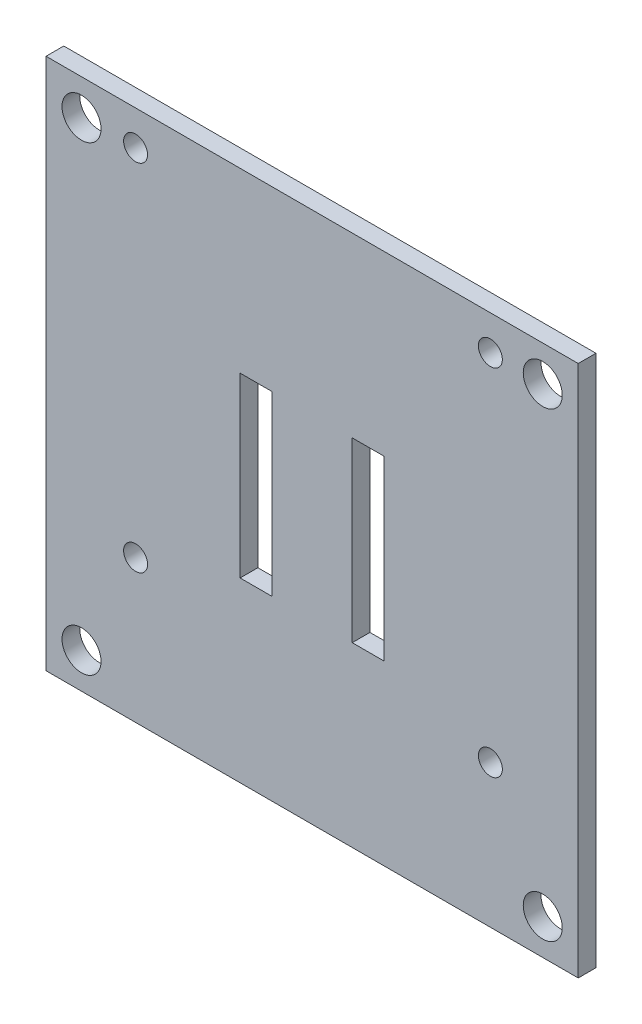
ISO-10303-21;
HEADER;
FILE_DESCRIPTION(('STEP AP214'),'2;1');
FILE_NAME('part.step','',(''),(''),'','','');
FILE_SCHEMA(('AUTOMOTIVE_DESIGN { 1 0 10303 214 1 1 1 1 }'));
ENDSEC;
DATA;
#1=APPLICATION_CONTEXT('core data for automotive mechanical design processes');
#2=APPLICATION_PROTOCOL_DEFINITION('international standard','automotive_design',2000,#1);
#3=PRODUCT_CONTEXT('',#1,'mechanical');
#4=PRODUCT('Part','Part','',(#3));
#5=PRODUCT_RELATED_PRODUCT_CATEGORY('part','',(#4));
#6=PRODUCT_DEFINITION_FORMATION('','',#4);
#7=PRODUCT_DEFINITION_CONTEXT('part definition',#1,'design');
#8=PRODUCT_DEFINITION('design','',#6,#7);
#9=PRODUCT_DEFINITION_SHAPE('','',#8);
#10=(LENGTH_UNIT() NAMED_UNIT(*) SI_UNIT(.MILLI.,.METRE.));
#11=(NAMED_UNIT(*) PLANE_ANGLE_UNIT() SI_UNIT($,.RADIAN.));
#12=(NAMED_UNIT(*) SI_UNIT($,.STERADIAN.) SOLID_ANGLE_UNIT());
#13=UNCERTAINTY_MEASURE_WITH_UNIT(LENGTH_MEASURE(1.E-05),#10,'distance_accuracy_value','');
#14=(GEOMETRIC_REPRESENTATION_CONTEXT(3) GLOBAL_UNCERTAINTY_ASSIGNED_CONTEXT((#13)) GLOBAL_UNIT_ASSIGNED_CONTEXT((#10,
#11,#12)) REPRESENTATION_CONTEXT('',''));
#15=CARTESIAN_POINT('',(0.,0.,0.));
#16=DIRECTION('',(0.,0.,1.));
#17=DIRECTION('',(1.,0.,0.));
#18=AXIS2_PLACEMENT_3D('',#15,#16,#17);
#19=CARTESIAN_POINT('',(38.1,-38.1,2.54));
#20=DIRECTION('',(-1.,0.,0.));
#21=DIRECTION('',(0.,0.,1.));
#22=AXIS2_PLACEMENT_3D('',#19,#20,#21);
#23=PLANE('',#22);
#24=DIRECTION('',(0.,1.,0.));
#25=VECTOR('',#24,1.);
#26=CARTESIAN_POINT('',(38.1,-38.1,0.));
#27=LINE('',#26,#25);
#28=CARTESIAN_POINT('',(38.1,-38.1,0.));
#29=VERTEX_POINT('',#28);
#30=CARTESIAN_POINT('',(38.1,38.1,0.));
#31=VERTEX_POINT('',#30);
#32=EDGE_CURVE('E191',#29,#31,#27,.T.);
#33=ORIENTED_EDGE('',*,*,#32,.T.);
#34=DIRECTION('',(0.,0.,-1.));
#35=VECTOR('',#34,1.);
#36=CARTESIAN_POINT('',(38.1,38.1,2.54));
#37=LINE('',#36,#35);
#38=CARTESIAN_POINT('',(38.1,38.1,2.54));
#39=VERTEX_POINT('',#38);
#40=EDGE_CURVE('E218',#39,#31,#37,.T.);
#41=ORIENTED_EDGE('',*,*,#40,.F.);
#42=DIRECTION('',(0.,1.,0.));
#43=VECTOR('',#42,1.);
#44=CARTESIAN_POINT('',(38.1,-38.1,2.54));
#45=LINE('',#44,#43);
#46=CARTESIAN_POINT('',(38.1,-38.1,2.54));
#47=VERTEX_POINT('',#46);
#48=EDGE_CURVE('E192',#47,#39,#45,.T.);
#49=ORIENTED_EDGE('',*,*,#48,.F.);
#50=DIRECTION('',(0.,0.,-1.));
#51=VECTOR('',#50,1.);
#52=CARTESIAN_POINT('',(38.1,-38.1,2.54));
#53=LINE('',#52,#51);
#54=EDGE_CURVE('E202',#47,#29,#53,.T.);
#55=ORIENTED_EDGE('',*,*,#54,.T.);
#56=EDGE_LOOP('',(#33,#41,#49,#55));
#57=FACE_BOUND('',#56,.T.);
#58=ADVANCED_FACE('F32',(#57),#23,.F.);
#59=CARTESIAN_POINT('',(-38.1,38.1,2.54));
#60=DIRECTION('',(0.,-1.,0.));
#61=DIRECTION('',(0.,0.,-1.));
#62=AXIS2_PLACEMENT_3D('',#59,#60,#61);
#63=PLANE('',#62);
#64=DIRECTION('',(-1.,0.,0.));
#65=VECTOR('',#64,1.);
#66=CARTESIAN_POINT('',(-38.1,38.1,0.));
#67=LINE('',#66,#65);
#68=CARTESIAN_POINT('',(-38.1,38.1,0.));
#69=VERTEX_POINT('',#68);
#70=EDGE_CURVE('E205',#31,#69,#67,.T.);
#71=ORIENTED_EDGE('',*,*,#70,.T.);
#72=DIRECTION('',(0.,0.,-1.));
#73=VECTOR('',#72,1.);
#74=CARTESIAN_POINT('',(-38.1,38.1,2.54));
#75=LINE('',#74,#73);
#76=CARTESIAN_POINT('',(-38.1,38.1,2.54));
#77=VERTEX_POINT('',#76);
#78=EDGE_CURVE('E215',#77,#69,#75,.T.);
#79=ORIENTED_EDGE('',*,*,#78,.F.);
#80=DIRECTION('',(-1.,0.,0.));
#81=VECTOR('',#80,1.);
#82=CARTESIAN_POINT('',(-38.1,38.1,2.54));
#83=LINE('',#82,#81);
#84=EDGE_CURVE('E195',#39,#77,#83,.T.);
#85=ORIENTED_EDGE('',*,*,#84,.F.);
#86=ORIENTED_EDGE('',*,*,#40,.T.);
#87=EDGE_LOOP('',(#71,#79,#85,#86));
#88=FACE_BOUND('',#87,.T.);
#89=ADVANCED_FACE('F300',(#88),#63,.F.);
#90=CARTESIAN_POINT('',(-38.1,-38.1,2.54));
#91=DIRECTION('',(1.,0.,0.));
#92=DIRECTION('',(0.,0.,-1.));
#93=AXIS2_PLACEMENT_3D('',#90,#91,#92);
#94=PLANE('',#93);
#95=DIRECTION('',(0.,-1.,0.));
#96=VECTOR('',#95,1.);
#97=CARTESIAN_POINT('',(-38.1,-38.1,0.));
#98=LINE('',#97,#96);
#99=CARTESIAN_POINT('',(-38.1,-38.1,0.));
#100=VERTEX_POINT('',#99);
#101=EDGE_CURVE('E207',#69,#100,#98,.T.);
#102=ORIENTED_EDGE('',*,*,#101,.T.);
#103=DIRECTION('',(0.,0.,-1.));
#104=VECTOR('',#103,1.);
#105=CARTESIAN_POINT('',(-38.1,-38.1,2.54));
#106=LINE('',#105,#104);
#107=CARTESIAN_POINT('',(-38.1,-38.1,2.54));
#108=VERTEX_POINT('',#107);
#109=EDGE_CURVE('E212',#108,#100,#106,.T.);
#110=ORIENTED_EDGE('',*,*,#109,.F.);
#111=DIRECTION('',(0.,-1.,0.));
#112=VECTOR('',#111,1.);
#113=CARTESIAN_POINT('',(-38.1,-38.1,2.54));
#114=LINE('',#113,#112);
#115=EDGE_CURVE('E198',#77,#108,#114,.T.);
#116=ORIENTED_EDGE('',*,*,#115,.F.);
#117=ORIENTED_EDGE('',*,*,#78,.T.);
#118=EDGE_LOOP('',(#102,#110,#116,#117));
#119=FACE_BOUND('',#118,.T.);
#120=ADVANCED_FACE('F294',(#119),#94,.F.);
#121=CARTESIAN_POINT('',(-38.1,-38.1,2.54));
#122=DIRECTION('',(0.,1.,0.));
#123=DIRECTION('',(0.,0.,1.));
#124=AXIS2_PLACEMENT_3D('',#121,#122,#123);
#125=PLANE('',#124);
#126=DIRECTION('',(1.,0.,0.));
#127=VECTOR('',#126,1.);
#128=CARTESIAN_POINT('',(-38.1,-38.1,0.));
#129=LINE('',#128,#127);
#130=EDGE_CURVE('E196',#100,#29,#129,.T.);
#131=ORIENTED_EDGE('',*,*,#130,.T.);
#132=ORIENTED_EDGE('',*,*,#54,.F.);
#133=DIRECTION('',(1.,0.,0.));
#134=VECTOR('',#133,1.);
#135=CARTESIAN_POINT('',(-38.1,-38.1,2.54));
#136=LINE('',#135,#134);
#137=EDGE_CURVE('E200',#108,#47,#136,.T.);
#138=ORIENTED_EDGE('',*,*,#137,.F.);
#139=ORIENTED_EDGE('',*,*,#109,.T.);
#140=EDGE_LOOP('',(#131,#132,#138,#139));
#141=FACE_BOUND('',#140,.T.);
#142=ADVANCED_FACE('F288',(#141),#125,.F.);
#143=CARTESIAN_POINT('',(0.,0.,2.54));
#144=DIRECTION('',(0.,0.,-1.));
#145=DIRECTION('',(-1.,0.,0.));
#146=AXIS2_PLACEMENT_3D('',#143,#144,#145);
#147=PLANE('',#146);
#148=CARTESIAN_POINT('',(-33.02,-33.02,2.54));
#149=DIRECTION('',(0.,0.,-1.));
#150=DIRECTION('',(-1.,0.,0.));
#151=AXIS2_PLACEMENT_3D('',#148,#149,#150);
#152=CIRCLE('',#151,2.794);
#153=CARTESIAN_POINT('',(-35.814,-33.02,2.54));
#154=VERTEX_POINT('',#153);
#155=EDGE_CURVE('E248',#154,#154,#152,.T.);
#156=ORIENTED_EDGE('',*,*,#155,.T.);
#157=EDGE_LOOP('',(#156));
#158=FACE_BOUND('',#157,.T.);
#159=CARTESIAN_POINT('',(33.02,-33.02,2.54));
#160=DIRECTION('',(0.,0.,-1.));
#161=DIRECTION('',(-1.,0.,0.));
#162=AXIS2_PLACEMENT_3D('',#159,#160,#161);
#163=CIRCLE('',#162,2.794);
#164=CARTESIAN_POINT('',(30.226,-33.02,2.54));
#165=VERTEX_POINT('',#164);
#166=EDGE_CURVE('E251',#165,#165,#163,.T.);
#167=ORIENTED_EDGE('',*,*,#166,.T.);
#168=EDGE_LOOP('',(#167));
#169=FACE_BOUND('',#168,.T.);
#170=CARTESIAN_POINT('',(33.02,33.02,2.54));
#171=DIRECTION('',(0.,0.,-1.));
#172=DIRECTION('',(-1.,0.,0.));
#173=AXIS2_PLACEMENT_3D('',#170,#171,#172);
#174=CIRCLE('',#173,2.794);
#175=CARTESIAN_POINT('',(30.226,33.02,2.54));
#176=VERTEX_POINT('',#175);
#177=EDGE_CURVE('E254',#176,#176,#174,.T.);
#178=ORIENTED_EDGE('',*,*,#177,.T.);
#179=EDGE_LOOP('',(#178));
#180=FACE_BOUND('',#179,.T.);
#181=CARTESIAN_POINT('',(-33.02,33.02,2.54));
#182=DIRECTION('',(0.,0.,-1.));
#183=DIRECTION('',(-1.,0.,0.));
#184=AXIS2_PLACEMENT_3D('',#181,#182,#183);
#185=CIRCLE('',#184,2.794);
#186=CARTESIAN_POINT('',(-35.814,33.02,2.54));
#187=VERTEX_POINT('',#186);
#188=EDGE_CURVE('E241',#187,#187,#185,.T.);
#189=ORIENTED_EDGE('',*,*,#188,.T.);
#190=EDGE_LOOP('',(#189));
#191=FACE_BOUND('',#190,.T.);
#192=DIRECTION('',(1.,0.,0.));
#193=VECTOR('',#192,1.);
#194=CARTESIAN_POINT('',(-10.3096654054034,-12.7,2.54));
#195=LINE('',#194,#193);
#196=CARTESIAN_POINT('',(-10.3096654054034,-12.7,2.54));
#197=VERTEX_POINT('',#196);
#198=CARTESIAN_POINT('',(-5.73766540540336,-12.7,2.54));
#199=VERTEX_POINT('',#198);
#200=EDGE_CURVE('E131',#197,#199,#195,.T.);
#201=ORIENTED_EDGE('',*,*,#200,.F.);
#202=DIRECTION('',(0.,-1.,0.));
#203=VECTOR('',#202,1.);
#204=CARTESIAN_POINT('',(-10.3096654054033,12.7,2.54));
#205=LINE('',#204,#203);
#206=CARTESIAN_POINT('',(-10.3096654054033,12.7,2.54));
#207=VERTEX_POINT('',#206);
#208=EDGE_CURVE('E46',#207,#197,#205,.T.);
#209=ORIENTED_EDGE('',*,*,#208,.F.);
#210=DIRECTION('',(-1.,0.,0.));
#211=VECTOR('',#210,1.);
#212=CARTESIAN_POINT('',(-10.3096654054033,12.7,2.54));
#213=LINE('',#212,#211);
#214=CARTESIAN_POINT('',(-5.73766540540333,12.7,2.54));
#215=VERTEX_POINT('',#214);
#216=EDGE_CURVE('E138',#215,#207,#213,.T.);
#217=ORIENTED_EDGE('',*,*,#216,.F.);
#218=DIRECTION('',(0.,1.,0.));
#219=VECTOR('',#218,1.);
#220=CARTESIAN_POINT('',(-5.73766540540333,12.7,2.54));
#221=LINE('',#220,#219);
#222=EDGE_CURVE('E122',#199,#215,#221,.T.);
#223=ORIENTED_EDGE('',*,*,#222,.F.);
#224=EDGE_LOOP('',(#201,#209,#217,#223));
#225=FACE_BOUND('',#224,.T.);
#226=DIRECTION('',(1.,0.,0.));
#227=VECTOR('',#226,1.);
#228=CARTESIAN_POINT('',(10.3096654054033,-12.7,2.54));
#229=LINE('',#228,#227);
#230=CARTESIAN_POINT('',(5.73766540540335,-12.7,2.54));
#231=VERTEX_POINT('',#230);
#232=CARTESIAN_POINT('',(10.3096654054033,-12.7,2.54));
#233=VERTEX_POINT('',#232);
#234=EDGE_CURVE('E149',#231,#233,#229,.T.);
#235=ORIENTED_EDGE('',*,*,#234,.F.);
#236=DIRECTION('',(0.,-1.,0.));
#237=VECTOR('',#236,1.);
#238=CARTESIAN_POINT('',(5.73766540540334,12.7,2.54));
#239=LINE('',#238,#237);
#240=CARTESIAN_POINT('',(5.73766540540334,12.7,2.54));
#241=VERTEX_POINT('',#240);
#242=EDGE_CURVE('E145',#241,#231,#239,.T.);
#243=ORIENTED_EDGE('',*,*,#242,.F.);
#244=DIRECTION('',(-1.,0.,0.));
#245=VECTOR('',#244,1.);
#246=CARTESIAN_POINT('',(10.3096654054033,12.7,2.54));
#247=LINE('',#246,#245);
#248=CARTESIAN_POINT('',(10.3096654054033,12.7,2.54));
#249=VERTEX_POINT('',#248);
#250=EDGE_CURVE('E155',#249,#241,#247,.T.);
#251=ORIENTED_EDGE('',*,*,#250,.F.);
#252=DIRECTION('',(0.,1.,0.));
#253=VECTOR('',#252,1.);
#254=CARTESIAN_POINT('',(10.3096654054033,12.7,2.54));
#255=LINE('',#254,#253);
#256=EDGE_CURVE('E152',#233,#249,#255,.T.);
#257=ORIENTED_EDGE('',*,*,#256,.F.);
#258=EDGE_LOOP('',(#235,#243,#251,#257));
#259=FACE_BOUND('',#258,.T.);
#260=CARTESIAN_POINT('',(-25.2783226277738,33.1486818865829,2.54));
#261=DIRECTION('',(0.,0.,-1.));
#262=DIRECTION('',(-1.,0.,0.));
#263=AXIS2_PLACEMENT_3D('',#260,#261,#262);
#264=CIRCLE('',#263,1.7145);
#265=CARTESIAN_POINT('',(-26.9928226277739,33.1486818865829,2.54));
#266=VERTEX_POINT('',#265);
#267=EDGE_CURVE('E182',#266,#266,#264,.T.);
#268=ORIENTED_EDGE('',*,*,#267,.T.);
#269=EDGE_LOOP('',(#268));
#270=FACE_BOUND('',#269,.T.);
#271=CARTESIAN_POINT('',(25.5216773722261,33.1486818865829,2.54));
#272=DIRECTION('',(0.,0.,-1.));
#273=DIRECTION('',(-1.,0.,0.));
#274=AXIS2_PLACEMENT_3D('',#271,#272,#273);
#275=CIRCLE('',#274,1.7145);
#276=CARTESIAN_POINT('',(23.8071773722261,33.1486818865829,2.54));
#277=VERTEX_POINT('',#276);
#278=EDGE_CURVE('E179',#277,#277,#275,.T.);
#279=ORIENTED_EDGE('',*,*,#278,.T.);
#280=EDGE_LOOP('',(#279));
#281=FACE_BOUND('',#280,.T.);
#282=CARTESIAN_POINT('',(25.5216773722261,-17.6513181134171,2.54));
#283=DIRECTION('',(0.,0.,-1.));
#284=DIRECTION('',(-1.,0.,0.));
#285=AXIS2_PLACEMENT_3D('',#282,#283,#284);
#286=CIRCLE('',#285,1.7145);
#287=CARTESIAN_POINT('',(23.8071773722261,-17.6513181134171,2.54));
#288=VERTEX_POINT('',#287);
#289=EDGE_CURVE('E171',#288,#288,#286,.T.);
#290=ORIENTED_EDGE('',*,*,#289,.T.);
#291=EDGE_LOOP('',(#290));
#292=FACE_BOUND('',#291,.T.);
#293=CARTESIAN_POINT('',(-25.2783226277739,-17.6513181134171,2.54));
#294=DIRECTION('',(0.,0.,-1.));
#295=DIRECTION('',(-1.,0.,0.));
#296=AXIS2_PLACEMENT_3D('',#293,#294,#295);
#297=CIRCLE('',#296,1.7145);
#298=CARTESIAN_POINT('',(-26.9928226277739,-17.6513181134171,2.54));
#299=VERTEX_POINT('',#298);
#300=EDGE_CURVE('E188',#299,#299,#297,.T.);
#301=ORIENTED_EDGE('',*,*,#300,.T.);
#302=EDGE_LOOP('',(#301));
#303=FACE_BOUND('',#302,.T.);
#304=ORIENTED_EDGE('',*,*,#48,.T.);
#305=ORIENTED_EDGE('',*,*,#84,.T.);
#306=ORIENTED_EDGE('',*,*,#115,.T.);
#307=ORIENTED_EDGE('',*,*,#137,.T.);
#308=EDGE_LOOP('',(#304,#305,#306,#307));
#309=FACE_BOUND('',#308,.T.);
#310=ADVANCED_FACE('F135',(#158,#169,#180,#191,#225,#259,#270,#281,#292,#303,#309),#147,.F.);
#311=CARTESIAN_POINT('',(0.,0.,0.));
#312=DIRECTION('',(0.,0.,-1.));
#313=DIRECTION('',(-1.,0.,0.));
#314=AXIS2_PLACEMENT_3D('',#311,#312,#313);
#315=PLANE('',#314);
#316=CARTESIAN_POINT('',(-33.02,-33.02,0.));
#317=DIRECTION('',(0.,0.,-1.));
#318=DIRECTION('',(-1.,0.,0.));
#319=AXIS2_PLACEMENT_3D('',#316,#317,#318);
#320=CIRCLE('',#319,2.794);
#321=CARTESIAN_POINT('',(-35.814,-33.02,0.));
#322=VERTEX_POINT('',#321);
#323=EDGE_CURVE('E257',#322,#322,#320,.T.);
#324=ORIENTED_EDGE('',*,*,#323,.F.);
#325=EDGE_LOOP('',(#324));
#326=FACE_BOUND('',#325,.T.);
#327=CARTESIAN_POINT('',(33.02,-33.02,0.));
#328=DIRECTION('',(0.,0.,-1.));
#329=DIRECTION('',(-1.,0.,0.));
#330=AXIS2_PLACEMENT_3D('',#327,#328,#329);
#331=CIRCLE('',#330,2.794);
#332=CARTESIAN_POINT('',(30.226,-33.02,0.));
#333=VERTEX_POINT('',#332);
#334=EDGE_CURVE('E261',#333,#333,#331,.T.);
#335=ORIENTED_EDGE('',*,*,#334,.F.);
#336=EDGE_LOOP('',(#335));
#337=FACE_BOUND('',#336,.T.);
#338=CARTESIAN_POINT('',(33.02,33.02,0.));
#339=DIRECTION('',(0.,0.,-1.));
#340=DIRECTION('',(-1.,0.,0.));
#341=AXIS2_PLACEMENT_3D('',#338,#339,#340);
#342=CIRCLE('',#341,2.794);
#343=CARTESIAN_POINT('',(30.226,33.02,0.));
#344=VERTEX_POINT('',#343);
#345=EDGE_CURVE('E258',#344,#344,#342,.T.);
#346=ORIENTED_EDGE('',*,*,#345,.F.);
#347=EDGE_LOOP('',(#346));
#348=FACE_BOUND('',#347,.T.);
#349=CARTESIAN_POINT('',(-33.02,33.02,0.));
#350=DIRECTION('',(0.,0.,-1.));
#351=DIRECTION('',(-1.,0.,0.));
#352=AXIS2_PLACEMENT_3D('',#349,#350,#351);
#353=CIRCLE('',#352,2.794);
#354=CARTESIAN_POINT('',(-35.814,33.02,0.));
#355=VERTEX_POINT('',#354);
#356=EDGE_CURVE('E243',#355,#355,#353,.T.);
#357=ORIENTED_EDGE('',*,*,#356,.F.);
#358=EDGE_LOOP('',(#357));
#359=FACE_BOUND('',#358,.T.);
#360=DIRECTION('',(0.,1.,0.));
#361=VECTOR('',#360,1.);
#362=CARTESIAN_POINT('',(-10.3096654054033,0.,0.));
#363=LINE('',#362,#361);
#364=CARTESIAN_POINT('',(-10.3096654054034,-12.7,0.));
#365=VERTEX_POINT('',#364);
#366=CARTESIAN_POINT('',(-10.3096654054033,12.7,0.));
#367=VERTEX_POINT('',#366);
#368=EDGE_CURVE('E11',#365,#367,#363,.T.);
#369=ORIENTED_EDGE('',*,*,#368,.F.);
#370=DIRECTION('',(-1.,0.,0.));
#371=VECTOR('',#370,1.);
#372=CARTESIAN_POINT('',(0.,-12.7,0.));
#373=LINE('',#372,#371);
#374=CARTESIAN_POINT('',(-5.73766540540336,-12.7,0.));
#375=VERTEX_POINT('',#374);
#376=EDGE_CURVE('E230',#375,#365,#373,.T.);
#377=ORIENTED_EDGE('',*,*,#376,.F.);
#378=DIRECTION('',(0.,-1.,0.));
#379=VECTOR('',#378,1.);
#380=CARTESIAN_POINT('',(-5.73766540540334,0.,0.));
#381=LINE('',#380,#379);
#382=CARTESIAN_POINT('',(-5.73766540540333,12.7,0.));
#383=VERTEX_POINT('',#382);
#384=EDGE_CURVE('E125',#383,#375,#381,.T.);
#385=ORIENTED_EDGE('',*,*,#384,.F.);
#386=DIRECTION('',(1.,0.,0.));
#387=VECTOR('',#386,1.);
#388=CARTESIAN_POINT('',(0.,12.7,0.));
#389=LINE('',#388,#387);
#390=EDGE_CURVE('E39',#367,#383,#389,.T.);
#391=ORIENTED_EDGE('',*,*,#390,.F.);
#392=EDGE_LOOP('',(#369,#377,#385,#391));
#393=FACE_BOUND('',#392,.T.);
#394=DIRECTION('',(0.,1.,0.));
#395=VECTOR('',#394,1.);
#396=CARTESIAN_POINT('',(5.73766540540334,0.,0.));
#397=LINE('',#396,#395);
#398=CARTESIAN_POINT('',(5.73766540540335,-12.7,0.));
#399=VERTEX_POINT('',#398);
#400=CARTESIAN_POINT('',(5.73766540540334,12.7,0.));
#401=VERTEX_POINT('',#400);
#402=EDGE_CURVE('E228',#399,#401,#397,.T.);
#403=ORIENTED_EDGE('',*,*,#402,.F.);
#404=DIRECTION('',(-1.,0.,0.));
#405=VECTOR('',#404,1.);
#406=CARTESIAN_POINT('',(0.,-12.7,0.));
#407=LINE('',#406,#405);
#408=CARTESIAN_POINT('',(10.3096654054033,-12.7,0.));
#409=VERTEX_POINT('',#408);
#410=EDGE_CURVE('E221',#409,#399,#407,.T.);
#411=ORIENTED_EDGE('',*,*,#410,.F.);
#412=DIRECTION('',(0.,-1.,0.));
#413=VECTOR('',#412,1.);
#414=CARTESIAN_POINT('',(10.3096654054033,0.,0.));
#415=LINE('',#414,#413);
#416=CARTESIAN_POINT('',(10.3096654054033,12.7,0.));
#417=VERTEX_POINT('',#416);
#418=EDGE_CURVE('E223',#417,#409,#415,.T.);
#419=ORIENTED_EDGE('',*,*,#418,.F.);
#420=DIRECTION('',(1.,0.,0.));
#421=VECTOR('',#420,1.);
#422=CARTESIAN_POINT('',(0.,12.7,0.));
#423=LINE('',#422,#421);
#424=EDGE_CURVE('E226',#401,#417,#423,.T.);
#425=ORIENTED_EDGE('',*,*,#424,.F.);
#426=EDGE_LOOP('',(#403,#411,#419,#425));
#427=FACE_BOUND('',#426,.T.);
#428=CARTESIAN_POINT('',(-25.2783226277738,33.1486818865829,0.));
#429=DIRECTION('',(0.,0.,-1.));
#430=DIRECTION('',(-1.,0.,0.));
#431=AXIS2_PLACEMENT_3D('',#428,#429,#430);
#432=CIRCLE('',#431,1.7145);
#433=CARTESIAN_POINT('',(-26.9928226277739,33.1486818865829,0.));
#434=VERTEX_POINT('',#433);
#435=EDGE_CURVE('E168',#434,#434,#432,.T.);
#436=ORIENTED_EDGE('',*,*,#435,.F.);
#437=EDGE_LOOP('',(#436));
#438=FACE_BOUND('',#437,.T.);
#439=CARTESIAN_POINT('',(25.5216773722261,33.1486818865829,0.));
#440=DIRECTION('',(0.,0.,-1.));
#441=DIRECTION('',(-1.,0.,0.));
#442=AXIS2_PLACEMENT_3D('',#439,#440,#441);
#443=CIRCLE('',#442,1.7145);
#444=CARTESIAN_POINT('',(23.8071773722261,33.1486818865829,0.));
#445=VERTEX_POINT('',#444);
#446=EDGE_CURVE('E172',#445,#445,#443,.T.);
#447=ORIENTED_EDGE('',*,*,#446,.F.);
#448=EDGE_LOOP('',(#447));
#449=FACE_BOUND('',#448,.T.);
#450=CARTESIAN_POINT('',(25.5216773722261,-17.6513181134171,0.));
#451=DIRECTION('',(0.,0.,-1.));
#452=DIRECTION('',(-1.,0.,0.));
#453=AXIS2_PLACEMENT_3D('',#450,#451,#452);
#454=CIRCLE('',#453,1.7145);
#455=CARTESIAN_POINT('',(23.8071773722261,-17.6513181134171,0.));
#456=VERTEX_POINT('',#455);
#457=EDGE_CURVE('E161',#456,#456,#454,.T.);
#458=ORIENTED_EDGE('',*,*,#457,.F.);
#459=EDGE_LOOP('',(#458));
#460=FACE_BOUND('',#459,.T.);
#461=CARTESIAN_POINT('',(-25.2783226277739,-17.6513181134171,0.));
#462=DIRECTION('',(0.,0.,-1.));
#463=DIRECTION('',(-1.,0.,0.));
#464=AXIS2_PLACEMENT_3D('',#461,#462,#463);
#465=CIRCLE('',#464,1.7145);
#466=CARTESIAN_POINT('',(-26.9928226277739,-17.6513181134171,0.));
#467=VERTEX_POINT('',#466);
#468=EDGE_CURVE('E185',#467,#467,#465,.T.);
#469=ORIENTED_EDGE('',*,*,#468,.F.);
#470=EDGE_LOOP('',(#469));
#471=FACE_BOUND('',#470,.T.);
#472=ORIENTED_EDGE('',*,*,#32,.F.);
#473=ORIENTED_EDGE('',*,*,#130,.F.);
#474=ORIENTED_EDGE('',*,*,#101,.F.);
#475=ORIENTED_EDGE('',*,*,#70,.F.);
#476=EDGE_LOOP('',(#472,#473,#474,#475));
#477=FACE_BOUND('',#476,.T.);
#478=ADVANCED_FACE('F238',(#326,#337,#348,#359,#393,#427,#438,#449,#460,#471,#477),#315,.T.);
#479=CARTESIAN_POINT('',(-25.2783226277739,-17.6513181134171,5.08));
#480=DIRECTION('',(0.,0.,-1.));
#481=DIRECTION('',(-1.,0.,0.));
#482=AXIS2_PLACEMENT_3D('',#479,#480,#481);
#483=CYLINDRICAL_SURFACE('',#482,1.7145);
#484=ORIENTED_EDGE('',*,*,#468,.T.);
#485=EDGE_LOOP('',(#484));
#486=FACE_BOUND('',#485,.T.);
#487=ORIENTED_EDGE('',*,*,#300,.F.);
#488=EDGE_LOOP('',(#487));
#489=FACE_BOUND('',#488,.T.);
#490=ADVANCED_FACE('F272',(#486,#489),#483,.F.);
#491=CARTESIAN_POINT('',(25.5216773722261,-17.6513181134171,5.08));
#492=DIRECTION('',(0.,0.,-1.));
#493=DIRECTION('',(-1.,0.,0.));
#494=AXIS2_PLACEMENT_3D('',#491,#492,#493);
#495=CYLINDRICAL_SURFACE('',#494,1.7145);
#496=ORIENTED_EDGE('',*,*,#457,.T.);
#497=EDGE_LOOP('',(#496));
#498=FACE_BOUND('',#497,.T.);
#499=ORIENTED_EDGE('',*,*,#289,.F.);
#500=EDGE_LOOP('',(#499));
#501=FACE_BOUND('',#500,.T.);
#502=ADVANCED_FACE('F339',(#498,#501),#495,.F.);
#503=CARTESIAN_POINT('',(25.5216773722261,33.1486818865829,5.08));
#504=DIRECTION('',(0.,0.,-1.));
#505=DIRECTION('',(-1.,0.,0.));
#506=AXIS2_PLACEMENT_3D('',#503,#504,#505);
#507=CYLINDRICAL_SURFACE('',#506,1.7145);
#508=ORIENTED_EDGE('',*,*,#446,.T.);
#509=EDGE_LOOP('',(#508));
#510=FACE_BOUND('',#509,.T.);
#511=ORIENTED_EDGE('',*,*,#278,.F.);
#512=EDGE_LOOP('',(#511));
#513=FACE_BOUND('',#512,.T.);
#514=ADVANCED_FACE('F349',(#510,#513),#507,.F.);
#515=CARTESIAN_POINT('',(-25.2783226277738,33.1486818865829,5.08));
#516=DIRECTION('',(0.,0.,-1.));
#517=DIRECTION('',(-1.,0.,0.));
#518=AXIS2_PLACEMENT_3D('',#515,#516,#517);
#519=CYLINDRICAL_SURFACE('',#518,1.7145);
#520=ORIENTED_EDGE('',*,*,#435,.T.);
#521=EDGE_LOOP('',(#520));
#522=FACE_BOUND('',#521,.T.);
#523=ORIENTED_EDGE('',*,*,#267,.F.);
#524=EDGE_LOOP('',(#523));
#525=FACE_BOUND('',#524,.T.);
#526=ADVANCED_FACE('F359',(#522,#525),#519,.F.);
#527=CARTESIAN_POINT('',(5.73766540540334,12.7,-2.54));
#528=DIRECTION('',(-1.,0.,0.));
#529=DIRECTION('',(0.,-1.,0.));
#530=AXIS2_PLACEMENT_3D('',#527,#528,#529);
#531=PLANE('',#530);
#532=ORIENTED_EDGE('',*,*,#402,.T.);
#533=DIRECTION('',(0.,0.,1.));
#534=VECTOR('',#533,1.);
#535=CARTESIAN_POINT('',(5.73766540540334,12.7,-2.54));
#536=LINE('',#535,#534);
#537=EDGE_CURVE('E159',#401,#241,#536,.T.);
#538=ORIENTED_EDGE('',*,*,#537,.T.);
#539=ORIENTED_EDGE('',*,*,#242,.T.);
#540=DIRECTION('',(0.,0.,1.));
#541=VECTOR('',#540,1.);
#542=CARTESIAN_POINT('',(5.73766540540335,-12.7,-2.54));
#543=LINE('',#542,#541);
#544=EDGE_CURVE('E158',#399,#231,#543,.T.);
#545=ORIENTED_EDGE('',*,*,#544,.F.);
#546=EDGE_LOOP('',(#532,#538,#539,#545));
#547=FACE_BOUND('',#546,.T.);
#548=ADVANCED_FACE('F369',(#547),#531,.F.);
#549=CARTESIAN_POINT('',(10.3096654054033,12.7,-2.54));
#550=DIRECTION('',(0.,1.,0.));
#551=DIRECTION('',(0.,0.,1.));
#552=AXIS2_PLACEMENT_3D('',#549,#550,#551);
#553=PLANE('',#552);
#554=ORIENTED_EDGE('',*,*,#424,.T.);
#555=DIRECTION('',(0.,0.,1.));
#556=VECTOR('',#555,1.);
#557=CARTESIAN_POINT('',(10.3096654054033,12.7,-2.54));
#558=LINE('',#557,#556);
#559=EDGE_CURVE('E162',#417,#249,#558,.T.);
#560=ORIENTED_EDGE('',*,*,#559,.T.);
#561=ORIENTED_EDGE('',*,*,#250,.T.);
#562=ORIENTED_EDGE('',*,*,#537,.F.);
#563=EDGE_LOOP('',(#554,#560,#561,#562));
#564=FACE_BOUND('',#563,.T.);
#565=ADVANCED_FACE('F379',(#564),#553,.F.);
#566=CARTESIAN_POINT('',(10.3096654054033,12.7,-2.54));
#567=DIRECTION('',(1.,0.,0.));
#568=DIRECTION('',(0.,1.,0.));
#569=AXIS2_PLACEMENT_3D('',#566,#567,#568);
#570=PLANE('',#569);
#571=ORIENTED_EDGE('',*,*,#418,.T.);
#572=DIRECTION('',(0.,0.,1.));
#573=VECTOR('',#572,1.);
#574=CARTESIAN_POINT('',(10.3096654054033,-12.7,-2.54));
#575=LINE('',#574,#573);
#576=EDGE_CURVE('E164',#409,#233,#575,.T.);
#577=ORIENTED_EDGE('',*,*,#576,.T.);
#578=ORIENTED_EDGE('',*,*,#256,.T.);
#579=ORIENTED_EDGE('',*,*,#559,.F.);
#580=EDGE_LOOP('',(#571,#577,#578,#579));
#581=FACE_BOUND('',#580,.T.);
#582=ADVANCED_FACE('F389',(#581),#570,.F.);
#583=CARTESIAN_POINT('',(10.3096654054033,-12.7,-2.54));
#584=DIRECTION('',(0.,-1.,0.));
#585=DIRECTION('',(0.,0.,-1.));
#586=AXIS2_PLACEMENT_3D('',#583,#584,#585);
#587=PLANE('',#586);
#588=ORIENTED_EDGE('',*,*,#410,.T.);
#589=ORIENTED_EDGE('',*,*,#544,.T.);
#590=ORIENTED_EDGE('',*,*,#234,.T.);
#591=ORIENTED_EDGE('',*,*,#576,.F.);
#592=EDGE_LOOP('',(#588,#589,#590,#591));
#593=FACE_BOUND('',#592,.T.);
#594=ADVANCED_FACE('F399',(#593),#587,.F.);
#595=CARTESIAN_POINT('',(-10.3096654054033,12.7,-2.54));
#596=DIRECTION('',(-1.,0.,0.));
#597=DIRECTION('',(0.,-1.,0.));
#598=AXIS2_PLACEMENT_3D('',#595,#596,#597);
#599=PLANE('',#598);
#600=ORIENTED_EDGE('',*,*,#368,.T.);
#601=DIRECTION('',(0.,0.,1.));
#602=VECTOR('',#601,1.);
#603=CARTESIAN_POINT('',(-10.3096654054033,12.7,-2.54));
#604=LINE('',#603,#602);
#605=EDGE_CURVE('E143',#367,#207,#604,.T.);
#606=ORIENTED_EDGE('',*,*,#605,.T.);
#607=ORIENTED_EDGE('',*,*,#208,.T.);
#608=DIRECTION('',(0.,0.,1.));
#609=VECTOR('',#608,1.);
#610=CARTESIAN_POINT('',(-10.3096654054034,-12.7,-2.54));
#611=LINE('',#610,#609);
#612=EDGE_CURVE('E128',#365,#197,#611,.T.);
#613=ORIENTED_EDGE('',*,*,#612,.F.);
#614=EDGE_LOOP('',(#600,#606,#607,#613));
#615=FACE_BOUND('',#614,.T.);
#616=ADVANCED_FACE('F240',(#615),#599,.F.);
#617=CARTESIAN_POINT('',(-10.3096654054033,12.7,-2.54));
#618=DIRECTION('',(0.,1.,0.));
#619=DIRECTION('',(-1.,0.,0.));
#620=AXIS2_PLACEMENT_3D('',#617,#618,#619);
#621=PLANE('',#620);
#622=ORIENTED_EDGE('',*,*,#390,.T.);
#623=DIRECTION('',(0.,0.,1.));
#624=VECTOR('',#623,1.);
#625=CARTESIAN_POINT('',(-5.73766540540333,12.7,-2.54));
#626=LINE('',#625,#624);
#627=EDGE_CURVE('E127',#383,#215,#626,.T.);
#628=ORIENTED_EDGE('',*,*,#627,.T.);
#629=ORIENTED_EDGE('',*,*,#216,.T.);
#630=ORIENTED_EDGE('',*,*,#605,.F.);
#631=EDGE_LOOP('',(#622,#628,#629,#630));
#632=FACE_BOUND('',#631,.T.);
#633=ADVANCED_FACE('F235',(#632),#621,.F.);
#634=CARTESIAN_POINT('',(-5.73766540540333,12.7,-2.54));
#635=DIRECTION('',(1.,0.,0.));
#636=DIRECTION('',(0.,1.,0.));
#637=AXIS2_PLACEMENT_3D('',#634,#635,#636);
#638=PLANE('',#637);
#639=ORIENTED_EDGE('',*,*,#384,.T.);
#640=DIRECTION('',(0.,0.,1.));
#641=VECTOR('',#640,1.);
#642=CARTESIAN_POINT('',(-5.73766540540336,-12.7,-2.54));
#643=LINE('',#642,#641);
#644=EDGE_CURVE('E54',#375,#199,#643,.T.);
#645=ORIENTED_EDGE('',*,*,#644,.T.);
#646=ORIENTED_EDGE('',*,*,#222,.T.);
#647=ORIENTED_EDGE('',*,*,#627,.F.);
#648=EDGE_LOOP('',(#639,#645,#646,#647));
#649=FACE_BOUND('',#648,.T.);
#650=ADVANCED_FACE('F119',(#649),#638,.F.);
#651=CARTESIAN_POINT('',(-10.3096654054034,-12.7,-2.54));
#652=DIRECTION('',(0.,-1.,0.));
#653=DIRECTION('',(0.,0.,-1.));
#654=AXIS2_PLACEMENT_3D('',#651,#652,#653);
#655=PLANE('',#654);
#656=ORIENTED_EDGE('',*,*,#376,.T.);
#657=ORIENTED_EDGE('',*,*,#612,.T.);
#658=ORIENTED_EDGE('',*,*,#200,.T.);
#659=ORIENTED_EDGE('',*,*,#644,.F.);
#660=EDGE_LOOP('',(#656,#657,#658,#659));
#661=FACE_BOUND('',#660,.T.);
#662=ADVANCED_FACE('F132',(#661),#655,.F.);
#663=CARTESIAN_POINT('',(-33.02,33.02,5.08));
#664=DIRECTION('',(0.,0.,-1.));
#665=DIRECTION('',(-1.,0.,0.));
#666=AXIS2_PLACEMENT_3D('',#663,#664,#665);
#667=CYLINDRICAL_SURFACE('',#666,2.794);
#668=ORIENTED_EDGE('',*,*,#356,.T.);
#669=EDGE_LOOP('',(#668));
#670=FACE_BOUND('',#669,.T.);
#671=ORIENTED_EDGE('',*,*,#188,.F.);
#672=EDGE_LOOP('',(#671));
#673=FACE_BOUND('',#672,.T.);
#674=ADVANCED_FACE('F280',(#670,#673),#667,.F.);
#675=CARTESIAN_POINT('',(33.02,33.02,5.08));
#676=DIRECTION('',(0.,0.,-1.));
#677=DIRECTION('',(-1.,0.,0.));
#678=AXIS2_PLACEMENT_3D('',#675,#676,#677);
#679=CYLINDRICAL_SURFACE('',#678,2.794);
#680=ORIENTED_EDGE('',*,*,#345,.T.);
#681=EDGE_LOOP('',(#680));
#682=FACE_BOUND('',#681,.T.);
#683=ORIENTED_EDGE('',*,*,#177,.F.);
#684=EDGE_LOOP('',(#683));
#685=FACE_BOUND('',#684,.T.);
#686=ADVANCED_FACE('F283',(#682,#685),#679,.F.);
#687=CARTESIAN_POINT('',(33.02,-33.02,5.08));
#688=DIRECTION('',(0.,0.,-1.));
#689=DIRECTION('',(-1.,0.,0.));
#690=AXIS2_PLACEMENT_3D('',#687,#688,#689);
#691=CYLINDRICAL_SURFACE('',#690,2.794);
#692=ORIENTED_EDGE('',*,*,#334,.T.);
#693=EDGE_LOOP('',(#692));
#694=FACE_BOUND('',#693,.T.);
#695=ORIENTED_EDGE('',*,*,#166,.F.);
#696=EDGE_LOOP('',(#695));
#697=FACE_BOUND('',#696,.T.);
#698=ADVANCED_FACE('F464',(#694,#697),#691,.F.);
#699=CARTESIAN_POINT('',(-33.02,-33.02,5.08));
#700=DIRECTION('',(0.,0.,-1.));
#701=DIRECTION('',(-1.,0.,0.));
#702=AXIS2_PLACEMENT_3D('',#699,#700,#701);
#703=CYLINDRICAL_SURFACE('',#702,2.794);
#704=ORIENTED_EDGE('',*,*,#323,.T.);
#705=EDGE_LOOP('',(#704));
#706=FACE_BOUND('',#705,.T.);
#707=ORIENTED_EDGE('',*,*,#155,.F.);
#708=EDGE_LOOP('',(#707));
#709=FACE_BOUND('',#708,.T.);
#710=ADVANCED_FACE('F267',(#706,#709),#703,.F.);
#711=CLOSED_SHELL('',(#58,#89,#120,#142,#310,#478,#490,#502,#514,#526,#548,#565,#582,#594,#616,
#633,#650,#662,#674,#686,#698,#710));
#712=MANIFOLD_SOLID_BREP('B2',#711);
#713=ADVANCED_BREP_SHAPE_REPRESENTATION('',(#18,#712),#14);
#714=SHAPE_DEFINITION_REPRESENTATION(#9,#713);
ENDSEC;
END-ISO-10303-21;
